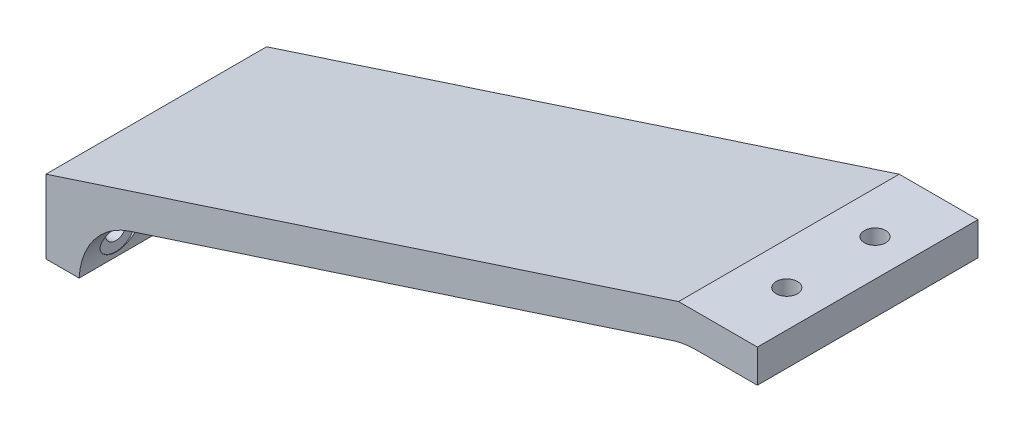
ISO-10303-21;
HEADER;
FILE_DESCRIPTION(('STEP AP214'),'2;1');
FILE_NAME('part.step','',(''),(''),'','','');
FILE_SCHEMA(('AUTOMOTIVE_DESIGN { 1 0 10303 214 1 1 1 1 }'));
ENDSEC;
DATA;
#1=APPLICATION_CONTEXT('core data for automotive mechanical design processes');
#2=APPLICATION_PROTOCOL_DEFINITION('international standard','automotive_design',2000,#1);
#3=PRODUCT_CONTEXT('',#1,'mechanical');
#4=PRODUCT('Part','Part','',(#3));
#5=PRODUCT_RELATED_PRODUCT_CATEGORY('part','',(#4));
#6=PRODUCT_DEFINITION_FORMATION('','',#4);
#7=PRODUCT_DEFINITION_CONTEXT('part definition',#1,'design');
#8=PRODUCT_DEFINITION('design','',#6,#7);
#9=PRODUCT_DEFINITION_SHAPE('','',#8);
#10=(LENGTH_UNIT() NAMED_UNIT(*) SI_UNIT(.MILLI.,.METRE.));
#11=(NAMED_UNIT(*) PLANE_ANGLE_UNIT() SI_UNIT($,.RADIAN.));
#12=(NAMED_UNIT(*) SI_UNIT($,.STERADIAN.) SOLID_ANGLE_UNIT());
#13=UNCERTAINTY_MEASURE_WITH_UNIT(LENGTH_MEASURE(1.E-05),#10,'distance_accuracy_value','');
#14=(GEOMETRIC_REPRESENTATION_CONTEXT(3) GLOBAL_UNCERTAINTY_ASSIGNED_CONTEXT((#13)) GLOBAL_UNIT_ASSIGNED_CONTEXT((#10,
#11,#12)) REPRESENTATION_CONTEXT('',''));
#15=CARTESIAN_POINT('',(0.,0.,0.));
#16=DIRECTION('',(0.,0.,1.));
#17=DIRECTION('',(1.,0.,0.));
#18=AXIS2_PLACEMENT_3D('',#15,#16,#17);
#19=CARTESIAN_POINT('',(86.0160162238115,28.,15.));
#20=DIRECTION('',(0.309533925900526,-0.950888399717132,0.));
#21=DIRECTION('',(0.950888399717132,0.309533925900526,0.));
#22=AXIS2_PLACEMENT_3D('',#19,#20,#21);
#23=PLANE('',#22);
#24=DIRECTION('',(-0.950888399717132,-0.309533925900526,0.));
#25=VECTOR('',#24,1.);
#26=CARTESIAN_POINT('',(86.0160162238115,28.,-15.));
#27=LINE('',#26,#25);
#28=CARTESIAN_POINT('',(86.0160162238115,28.,-15.));
#29=VERTEX_POINT('',#28);
#30=CARTESIAN_POINT('',(0.,0.,-15.));
#31=VERTEX_POINT('',#30);
#32=EDGE_CURVE('E136',#29,#31,#27,.T.);
#33=ORIENTED_EDGE('',*,*,#32,.T.);
#34=DIRECTION('',(0.,0.,-1.));
#35=VECTOR('',#34,1.);
#36=CARTESIAN_POINT('',(0.,0.,15.));
#37=LINE('',#36,#35);
#38=CARTESIAN_POINT('',(0.,0.,15.));
#39=VERTEX_POINT('',#38);
#40=EDGE_CURVE('E118',#39,#31,#37,.T.);
#41=ORIENTED_EDGE('',*,*,#40,.F.);
#42=DIRECTION('',(-0.950888399717132,-0.309533925900526,0.));
#43=VECTOR('',#42,1.);
#44=CARTESIAN_POINT('',(86.0160162238115,28.,15.));
#45=LINE('',#44,#43);
#46=CARTESIAN_POINT('',(86.0160162238115,28.,15.));
#47=VERTEX_POINT('',#46);
#48=EDGE_CURVE('E124',#47,#39,#45,.T.);
#49=ORIENTED_EDGE('',*,*,#48,.F.);
#50=DIRECTION('',(0.,0.,-1.));
#51=VECTOR('',#50,1.);
#52=CARTESIAN_POINT('',(86.0160162238115,28.,15.));
#53=LINE('',#52,#51);
#54=EDGE_CURVE('E245',#47,#29,#53,.T.);
#55=ORIENTED_EDGE('',*,*,#54,.T.);
#56=EDGE_LOOP('',(#33,#41,#49,#55));
#57=FACE_BOUND('',#56,.T.);
#58=ADVANCED_FACE('F41',(#57),#23,.F.);
#59=CARTESIAN_POINT('',(0.,0.,15.));
#60=DIRECTION('',(1.,0.,0.));
#61=DIRECTION('',(0.,1.,0.));
#62=AXIS2_PLACEMENT_3D('',#59,#60,#61);
#63=PLANE('',#62);
#64=CARTESIAN_POINT('',(0.,-6.63378653813209,10.));
#65=DIRECTION('',(1.,0.,0.));
#66=DIRECTION('',(0.,0.,-1.));
#67=AXIS2_PLACEMENT_3D('',#64,#65,#66);
#68=CIRCLE('',#67,1.44999999999999);
#69=CARTESIAN_POINT('',(0.,-6.63378653813209,8.55000000000001));
#70=VERTEX_POINT('',#69);
#71=EDGE_CURVE('E289',#70,#70,#68,.T.);
#72=ORIENTED_EDGE('',*,*,#71,.T.);
#73=EDGE_LOOP('',(#72));
#74=FACE_BOUND('',#73,.T.);
#75=CARTESIAN_POINT('',(0.,-6.63378653813209,-10.));
#76=DIRECTION('',(1.,0.,0.));
#77=DIRECTION('',(0.,0.,-1.));
#78=AXIS2_PLACEMENT_3D('',#75,#76,#77);
#79=CIRCLE('',#78,1.44999999999999);
#80=CARTESIAN_POINT('',(0.,-6.63378653813209,-11.45));
#81=VERTEX_POINT('',#80);
#82=EDGE_CURVE('E286',#81,#81,#79,.T.);
#83=ORIENTED_EDGE('',*,*,#82,.T.);
#84=EDGE_LOOP('',(#83));
#85=FACE_BOUND('',#84,.T.);
#86=DIRECTION('',(0.,-1.,0.));
#87=VECTOR('',#86,1.);
#88=CARTESIAN_POINT('',(0.,0.,-15.));
#89=LINE('',#88,#87);
#90=CARTESIAN_POINT('',(0.,-10.,-15.));
#91=VERTEX_POINT('',#90);
#92=EDGE_CURVE('E247',#31,#91,#89,.T.);
#93=ORIENTED_EDGE('',*,*,#92,.T.);
#94=DIRECTION('',(0.,0.,-1.));
#95=VECTOR('',#94,1.);
#96=CARTESIAN_POINT('',(0.,-10.,15.));
#97=LINE('',#96,#95);
#98=CARTESIAN_POINT('',(0.,-10.,15.));
#99=VERTEX_POINT('',#98);
#100=EDGE_CURVE('E121',#99,#91,#97,.T.);
#101=ORIENTED_EDGE('',*,*,#100,.F.);
#102=DIRECTION('',(0.,-1.,0.));
#103=VECTOR('',#102,1.);
#104=CARTESIAN_POINT('',(0.,0.,15.));
#105=LINE('',#104,#103);
#106=EDGE_CURVE('E114',#39,#99,#105,.T.);
#107=ORIENTED_EDGE('',*,*,#106,.F.);
#108=ORIENTED_EDGE('',*,*,#40,.T.);
#109=EDGE_LOOP('',(#93,#101,#107,#108));
#110=FACE_BOUND('',#109,.T.);
#111=ADVANCED_FACE('F116',(#74,#85,#110),#63,.F.);
#112=CARTESIAN_POINT('',(0.,-10.,15.));
#113=DIRECTION('',(0.,1.,0.));
#114=DIRECTION('',(0.,0.,1.));
#115=AXIS2_PLACEMENT_3D('',#112,#113,#114);
#116=PLANE('',#115);
#117=DIRECTION('',(1.,0.,0.));
#118=VECTOR('',#117,1.);
#119=CARTESIAN_POINT('',(0.,-10.,-15.));
#120=LINE('',#119,#118);
#121=CARTESIAN_POINT('',(4.5,-10.,-15.));
#122=VERTEX_POINT('',#121);
#123=EDGE_CURVE('E250',#91,#122,#120,.T.);
#124=ORIENTED_EDGE('',*,*,#123,.T.);
#125=DIRECTION('',(0.,0.,-1.));
#126=VECTOR('',#125,1.);
#127=CARTESIAN_POINT('',(4.5,-10.,15.));
#128=LINE('',#127,#126);
#129=CARTESIAN_POINT('',(4.5,-10.,15.));
#130=VERTEX_POINT('',#129);
#131=EDGE_CURVE('E142',#130,#122,#128,.T.);
#132=ORIENTED_EDGE('',*,*,#131,.F.);
#133=DIRECTION('',(1.,0.,0.));
#134=VECTOR('',#133,1.);
#135=CARTESIAN_POINT('',(0.,-10.,15.));
#136=LINE('',#135,#134);
#137=EDGE_CURVE('E123',#99,#130,#136,.T.);
#138=ORIENTED_EDGE('',*,*,#137,.F.);
#139=ORIENTED_EDGE('',*,*,#100,.T.);
#140=EDGE_LOOP('',(#124,#132,#138,#139));
#141=FACE_BOUND('',#140,.T.);
#142=ADVANCED_FACE('F213',(#141),#116,.F.);
#143=CARTESIAN_POINT('',(4.5,-3.26757307626418,15.));
#144=DIRECTION('',(-0.309533925900526,0.950888399717132,0.));
#145=DIRECTION('',(-0.950888399717132,-0.309533925900526,0.));
#146=AXIS2_PLACEMENT_3D('',#143,#144,#145);
#147=PLANE('',#146);
#148=DIRECTION('',(0.950888399717132,0.309533925900526,0.));
#149=VECTOR('',#148,1.);
#150=CARTESIAN_POINT('',(4.5,-3.26757307626418,-15.));
#151=LINE('',#150,#149);
#152=CARTESIAN_POINT('',(11.3904204446033,-1.0245980941761,-15.));
#153=VERTEX_POINT('',#152);
#154=CARTESIAN_POINT('',(85.221291354747,23.0088839971713,-15.));
#155=VERTEX_POINT('',#154);
#156=EDGE_CURVE('E253',#153,#155,#151,.T.);
#157=ORIENTED_EDGE('',*,*,#156,.T.);
#158=DIRECTION('',(0.,0.,-1.));
#159=VECTOR('',#158,1.);
#160=CARTESIAN_POINT('',(85.221291354747,23.0088839971713,15.));
#161=LINE('',#160,#159);
#162=CARTESIAN_POINT('',(85.221291354747,23.0088839971713,15.));
#163=VERTEX_POINT('',#162);
#164=EDGE_CURVE('E59',#155,#163,#161,.F.);
#165=ORIENTED_EDGE('',*,*,#164,.T.);
#166=DIRECTION('',(0.950888399717132,0.309533925900526,0.));
#167=VECTOR('',#166,1.);
#168=CARTESIAN_POINT('',(4.5,-3.26757307626418,15.));
#169=LINE('',#168,#167);
#170=CARTESIAN_POINT('',(11.3904204446033,-1.0245980941761,15.));
#171=VERTEX_POINT('',#170);
#172=EDGE_CURVE('E232',#171,#163,#169,.T.);
#173=ORIENTED_EDGE('',*,*,#172,.F.);
#174=DIRECTION('',(0.,0.,-1.));
#175=VECTOR('',#174,1.);
#176=CARTESIAN_POINT('',(11.3904204446033,-1.0245980941761,15.));
#177=LINE('',#176,#175);
#178=EDGE_CURVE('E140',#171,#153,#177,.T.);
#179=ORIENTED_EDGE('',*,*,#178,.T.);
#180=EDGE_LOOP('',(#157,#165,#173,#179));
#181=FACE_BOUND('',#180,.T.);
#182=ADVANCED_FACE('F209',(#181),#147,.F.);
#183=CARTESIAN_POINT('',(86.73,23.5,15.));
#184=DIRECTION('',(0.,1.,0.));
#185=DIRECTION('',(0.,0.,1.));
#186=AXIS2_PLACEMENT_3D('',#183,#184,#185);
#187=PLANE('',#186);
#188=CARTESIAN_POINT('',(91.73,23.5,6.));
#189=DIRECTION('',(0.,-1.,0.));
#190=DIRECTION('',(0.,0.,-1.));
#191=AXIS2_PLACEMENT_3D('',#188,#189,#190);
#192=CIRCLE('',#191,1.44999999999999);
#193=CARTESIAN_POINT('',(91.73,23.5,4.55000000000001));
#194=VERTEX_POINT('',#193);
#195=EDGE_CURVE('E283',#194,#194,#192,.T.);
#196=ORIENTED_EDGE('',*,*,#195,.F.);
#197=EDGE_LOOP('',(#196));
#198=FACE_BOUND('',#197,.T.);
#199=CARTESIAN_POINT('',(91.73,23.5,-6.));
#200=DIRECTION('',(0.,-1.,0.));
#201=DIRECTION('',(0.,0.,-1.));
#202=AXIS2_PLACEMENT_3D('',#199,#200,#201);
#203=CIRCLE('',#202,1.44999999999999);
#204=CARTESIAN_POINT('',(91.73,23.5,-7.44999999999999));
#205=VERTEX_POINT('',#204);
#206=EDGE_CURVE('E277',#205,#205,#203,.T.);
#207=ORIENTED_EDGE('',*,*,#206,.F.);
#208=EDGE_LOOP('',(#207));
#209=FACE_BOUND('',#208,.T.);
#210=DIRECTION('',(1.,0.,0.));
#211=VECTOR('',#210,1.);
#212=CARTESIAN_POINT('',(86.73,23.5,15.));
#213=LINE('',#212,#211);
#214=CARTESIAN_POINT('',(88.3166306137522,23.5,15.));
#215=VERTEX_POINT('',#214);
#216=CARTESIAN_POINT('',(96.73,23.5,15.));
#217=VERTEX_POINT('',#216);
#218=EDGE_CURVE('E230',#215,#217,#213,.T.);
#219=ORIENTED_EDGE('',*,*,#218,.F.);
#220=DIRECTION('',(0.,0.,-1.));
#221=VECTOR('',#220,1.);
#222=CARTESIAN_POINT('',(88.3166306137522,23.5,-15.));
#223=LINE('',#222,#221);
#224=CARTESIAN_POINT('',(88.3166306137522,23.5,-15.));
#225=VERTEX_POINT('',#224);
#226=EDGE_CURVE('E137',#215,#225,#223,.T.);
#227=ORIENTED_EDGE('',*,*,#226,.T.);
#228=DIRECTION('',(1.,0.,0.));
#229=VECTOR('',#228,1.);
#230=CARTESIAN_POINT('',(86.73,23.5,-15.));
#231=LINE('',#230,#229);
#232=CARTESIAN_POINT('',(96.73,23.5,-15.));
#233=VERTEX_POINT('',#232);
#234=EDGE_CURVE('E255',#225,#233,#231,.T.);
#235=ORIENTED_EDGE('',*,*,#234,.T.);
#236=DIRECTION('',(0.,0.,-1.));
#237=VECTOR('',#236,1.);
#238=CARTESIAN_POINT('',(96.73,23.5,15.));
#239=LINE('',#238,#237);
#240=EDGE_CURVE('E236',#217,#233,#239,.T.);
#241=ORIENTED_EDGE('',*,*,#240,.F.);
#242=EDGE_LOOP('',(#219,#227,#235,#241));
#243=FACE_BOUND('',#242,.T.);
#244=ADVANCED_FACE('F205',(#198,#209,#243),#187,.F.);
#245=CARTESIAN_POINT('',(96.73,23.5,15.));
#246=DIRECTION('',(-1.,0.,0.));
#247=DIRECTION('',(0.,-1.,0.));
#248=AXIS2_PLACEMENT_3D('',#245,#246,#247);
#249=PLANE('',#248);
#250=DIRECTION('',(0.,1.,0.));
#251=VECTOR('',#250,1.);
#252=CARTESIAN_POINT('',(96.73,23.5,-15.));
#253=LINE('',#252,#251);
#254=CARTESIAN_POINT('',(96.73,28.,-15.));
#255=VERTEX_POINT('',#254);
#256=EDGE_CURVE('E257',#233,#255,#253,.T.);
#257=ORIENTED_EDGE('',*,*,#256,.T.);
#258=DIRECTION('',(0.,0.,-1.));
#259=VECTOR('',#258,1.);
#260=CARTESIAN_POINT('',(96.73,28.,15.));
#261=LINE('',#260,#259);
#262=CARTESIAN_POINT('',(96.73,28.,15.));
#263=VERTEX_POINT('',#262);
#264=EDGE_CURVE('E261',#263,#255,#261,.T.);
#265=ORIENTED_EDGE('',*,*,#264,.F.);
#266=DIRECTION('',(0.,1.,0.));
#267=VECTOR('',#266,1.);
#268=CARTESIAN_POINT('',(96.73,23.5,15.));
#269=LINE('',#268,#267);
#270=EDGE_CURVE('E238',#217,#263,#269,.T.);
#271=ORIENTED_EDGE('',*,*,#270,.F.);
#272=ORIENTED_EDGE('',*,*,#240,.T.);
#273=EDGE_LOOP('',(#257,#265,#271,#272));
#274=FACE_BOUND('',#273,.T.);
#275=ADVANCED_FACE('F201',(#274),#249,.F.);
#276=CARTESIAN_POINT('',(96.73,28.,15.));
#277=DIRECTION('',(0.,-1.,0.));
#278=DIRECTION('',(0.,0.,-1.));
#279=AXIS2_PLACEMENT_3D('',#276,#277,#278);
#280=PLANE('',#279);
#281=CARTESIAN_POINT('',(91.73,28.,6.));
#282=DIRECTION('',(0.,-1.,0.));
#283=DIRECTION('',(0.,0.,-1.));
#284=AXIS2_PLACEMENT_3D('',#281,#282,#283);
#285=CIRCLE('',#284,1.44999999999999);
#286=CARTESIAN_POINT('',(91.73,28.,4.55000000000001));
#287=VERTEX_POINT('',#286);
#288=EDGE_CURVE('E280',#287,#287,#285,.T.);
#289=ORIENTED_EDGE('',*,*,#288,.T.);
#290=EDGE_LOOP('',(#289));
#291=FACE_BOUND('',#290,.T.);
#292=CARTESIAN_POINT('',(91.73,28.,-6.));
#293=DIRECTION('',(0.,-1.,0.));
#294=DIRECTION('',(0.,0.,-1.));
#295=AXIS2_PLACEMENT_3D('',#292,#293,#294);
#296=CIRCLE('',#295,1.44999999999999);
#297=CARTESIAN_POINT('',(91.73,28.,-7.44999999999999));
#298=VERTEX_POINT('',#297);
#299=EDGE_CURVE('E248',#298,#298,#296,.T.);
#300=ORIENTED_EDGE('',*,*,#299,.T.);
#301=EDGE_LOOP('',(#300));
#302=FACE_BOUND('',#301,.T.);
#303=DIRECTION('',(-1.,0.,0.));
#304=VECTOR('',#303,1.);
#305=CARTESIAN_POINT('',(96.73,28.,-15.));
#306=LINE('',#305,#304);
#307=EDGE_CURVE('E133',#255,#29,#306,.T.);
#308=ORIENTED_EDGE('',*,*,#307,.T.);
#309=ORIENTED_EDGE('',*,*,#54,.F.);
#310=DIRECTION('',(-1.,0.,0.));
#311=VECTOR('',#310,1.);
#312=CARTESIAN_POINT('',(96.73,28.,15.));
#313=LINE('',#312,#311);
#314=EDGE_CURVE('E129',#263,#47,#313,.T.);
#315=ORIENTED_EDGE('',*,*,#314,.F.);
#316=ORIENTED_EDGE('',*,*,#264,.T.);
#317=EDGE_LOOP('',(#308,#309,#315,#316));
#318=FACE_BOUND('',#317,.T.);
#319=ADVANCED_FACE('F195',(#291,#302,#318),#280,.F.);
#320=CARTESIAN_POINT('',(0.,0.,15.));
#321=DIRECTION('',(0.,0.,1.));
#322=DIRECTION('',(1.,0.,0.));
#323=AXIS2_PLACEMENT_3D('',#320,#321,#322);
#324=PLANE('',#323);
#325=ORIENTED_EDGE('',*,*,#48,.T.);
#326=ORIENTED_EDGE('',*,*,#106,.T.);
#327=ORIENTED_EDGE('',*,*,#137,.T.);
#328=CARTESIAN_POINT('',(14.4857597036085,-10.5334820913474,15.));
#329=DIRECTION('',(0.,0.,1.));
#330=DIRECTION('',(1.,0.,0.));
#331=AXIS2_PLACEMENT_3D('',#328,#329,#330);
#332=CIRCLE('',#331,10.);
#333=EDGE_CURVE('E11',#130,#171,#332,.F.);
#334=ORIENTED_EDGE('',*,*,#333,.T.);
#335=ORIENTED_EDGE('',*,*,#172,.T.);
#336=CARTESIAN_POINT('',(88.3166306137522,13.5,15.));
#337=DIRECTION('',(0.,0.,1.));
#338=DIRECTION('',(1.,0.,0.));
#339=AXIS2_PLACEMENT_3D('',#336,#337,#338);
#340=CIRCLE('',#339,10.);
#341=EDGE_CURVE('E151',#163,#215,#340,.F.);
#342=ORIENTED_EDGE('',*,*,#341,.T.);
#343=ORIENTED_EDGE('',*,*,#218,.T.);
#344=ORIENTED_EDGE('',*,*,#270,.T.);
#345=ORIENTED_EDGE('',*,*,#314,.T.);
#346=EDGE_LOOP('',(#325,#326,#327,#334,#335,#342,#343,#344,#345));
#347=FACE_BOUND('',#346,.T.);
#348=ADVANCED_FACE('F127',(#347),#324,.T.);
#349=CARTESIAN_POINT('',(0.,0.,-15.));
#350=DIRECTION('',(0.,0.,1.));
#351=DIRECTION('',(1.,0.,0.));
#352=AXIS2_PLACEMENT_3D('',#349,#350,#351);
#353=PLANE('',#352);
#354=ORIENTED_EDGE('',*,*,#32,.F.);
#355=ORIENTED_EDGE('',*,*,#307,.F.);
#356=ORIENTED_EDGE('',*,*,#256,.F.);
#357=ORIENTED_EDGE('',*,*,#234,.F.);
#358=CARTESIAN_POINT('',(88.3166306137522,13.5,-15.));
#359=DIRECTION('',(0.,0.,1.));
#360=DIRECTION('',(1.,0.,0.));
#361=AXIS2_PLACEMENT_3D('',#358,#359,#360);
#362=CIRCLE('',#361,10.);
#363=EDGE_CURVE('E149',#225,#155,#362,.T.);
#364=ORIENTED_EDGE('',*,*,#363,.T.);
#365=ORIENTED_EDGE('',*,*,#156,.F.);
#366=CARTESIAN_POINT('',(14.4857597036085,-10.5334820913474,-15.));
#367=DIRECTION('',(0.,0.,1.));
#368=DIRECTION('',(1.,0.,0.));
#369=AXIS2_PLACEMENT_3D('',#366,#367,#368);
#370=CIRCLE('',#369,10.);
#371=EDGE_CURVE('E51',#153,#122,#370,.T.);
#372=ORIENTED_EDGE('',*,*,#371,.T.);
#373=ORIENTED_EDGE('',*,*,#123,.F.);
#374=ORIENTED_EDGE('',*,*,#92,.F.);
#375=EDGE_LOOP('',(#354,#355,#356,#357,#364,#365,#372,#373,#374));
#376=FACE_BOUND('',#375,.T.);
#377=ADVANCED_FACE('F191',(#376),#353,.F.);
#378=CARTESIAN_POINT('',(91.73,23.5,-6.));
#379=DIRECTION('',(0.,-1.,0.));
#380=DIRECTION('',(0.,0.,-1.));
#381=AXIS2_PLACEMENT_3D('',#378,#379,#380);
#382=CYLINDRICAL_SURFACE('',#381,1.44999999999999);
#383=ORIENTED_EDGE('',*,*,#299,.F.);
#384=EDGE_LOOP('',(#383));
#385=FACE_BOUND('',#384,.T.);
#386=ORIENTED_EDGE('',*,*,#206,.T.);
#387=EDGE_LOOP('',(#386));
#388=FACE_BOUND('',#387,.T.);
#389=ADVANCED_FACE('F187',(#385,#388),#382,.F.);
#390=CARTESIAN_POINT('',(91.73,23.5,6.));
#391=DIRECTION('',(0.,-1.,0.));
#392=DIRECTION('',(0.,0.,-1.));
#393=AXIS2_PLACEMENT_3D('',#390,#391,#392);
#394=CYLINDRICAL_SURFACE('',#393,1.44999999999999);
#395=ORIENTED_EDGE('',*,*,#288,.F.);
#396=EDGE_LOOP('',(#395));
#397=FACE_BOUND('',#396,.T.);
#398=ORIENTED_EDGE('',*,*,#195,.T.);
#399=EDGE_LOOP('',(#398));
#400=FACE_BOUND('',#399,.T.);
#401=ADVANCED_FACE('F183',(#397,#400),#394,.F.);
#402=CARTESIAN_POINT('',(4.5,-6.63378653813209,-10.));
#403=DIRECTION('',(1.,0.,0.));
#404=DIRECTION('',(0.,0.,-1.));
#405=AXIS2_PLACEMENT_3D('',#402,#403,#404);
#406=CYLINDRICAL_SURFACE('',#405,1.44999999999999);
#407=CARTESIAN_POINT('',(4.5,-6.63378653813209,-10.));
#408=DIRECTION('',(-1.,0.,0.));
#409=DIRECTION('',(0.,-1.,0.));
#410=AXIS2_PLACEMENT_3D('',#407,#408,#409);
#411=CIRCLE('',#410,1.44999999999999);
#412=CARTESIAN_POINT('',(4.5,-8.08378653813207,-10.));
#413=VERTEX_POINT('',#412);
#414=EDGE_CURVE('E46',#413,#413,#411,.F.);
#415=ORIENTED_EDGE('',*,*,#414,.T.);
#416=EDGE_LOOP('',(#415));
#417=FACE_BOUND('',#416,.T.);
#418=ORIENTED_EDGE('',*,*,#82,.F.);
#419=EDGE_LOOP('',(#418));
#420=FACE_BOUND('',#419,.T.);
#421=ADVANCED_FACE('F179',(#417,#420),#406,.F.);
#422=CARTESIAN_POINT('',(4.5,-6.63378653813209,10.));
#423=DIRECTION('',(1.,0.,0.));
#424=DIRECTION('',(0.,0.,-1.));
#425=AXIS2_PLACEMENT_3D('',#422,#423,#424);
#426=CYLINDRICAL_SURFACE('',#425,1.44999999999999);
#427=CARTESIAN_POINT('',(4.5,-6.63378653813209,10.));
#428=DIRECTION('',(-1.,0.,0.));
#429=DIRECTION('',(0.,-1.,0.));
#430=AXIS2_PLACEMENT_3D('',#427,#428,#429);
#431=CIRCLE('',#430,1.44999999999999);
#432=CARTESIAN_POINT('',(4.5,-8.08378653813208,10.));
#433=VERTEX_POINT('',#432);
#434=EDGE_CURVE('E306',#433,#433,#431,.F.);
#435=ORIENTED_EDGE('',*,*,#434,.T.);
#436=EDGE_LOOP('',(#435));
#437=FACE_BOUND('',#436,.T.);
#438=ORIENTED_EDGE('',*,*,#71,.F.);
#439=EDGE_LOOP('',(#438));
#440=FACE_BOUND('',#439,.T.);
#441=ADVANCED_FACE('F175',(#437,#440),#426,.F.);
#442=CARTESIAN_POINT('',(88.3166306137522,13.5,15.));
#443=DIRECTION('',(0.,0.,1.));
#444=DIRECTION('',(1.,0.,0.));
#445=AXIS2_PLACEMENT_3D('',#442,#443,#444);
#446=CYLINDRICAL_SURFACE('',#445,10.);
#447=ORIENTED_EDGE('',*,*,#341,.F.);
#448=ORIENTED_EDGE('',*,*,#164,.F.);
#449=ORIENTED_EDGE('',*,*,#363,.F.);
#450=ORIENTED_EDGE('',*,*,#226,.F.);
#451=EDGE_LOOP('',(#447,#448,#449,#450));
#452=FACE_BOUND('',#451,.T.);
#453=ADVANCED_FACE('F178',(#452),#446,.F.);
#454=CARTESIAN_POINT('',(14.4857597036085,-10.5334820913474,15.));
#455=DIRECTION('',(0.,0.,-1.));
#456=DIRECTION('',(-1.,0.,0.));
#457=AXIS2_PLACEMENT_3D('',#454,#455,#456);
#458=CYLINDRICAL_SURFACE('',#457,10.);
#459=CARTESIAN_POINT('',(4.55206954662678,-9.38378653813157,-9.99999999999946));
#460=CARTESIAN_POINT('',(4.55206982052395,-9.38378726165786,-9.84673741857194));
#461=CARTESIAN_POINT('',(4.55353082220492,-9.37094352722969,-9.69348206696144));
#462=CARTESIAN_POINT('',(4.55963299731034,-9.31994966077079,-9.39131360266087));
#463=CARTESIAN_POINT('',(4.56427389402336,-9.28180173069613,-9.24240011332151));
#464=CARTESIAN_POINT('',(4.57746897504317,-9.18132635153864,-8.95310323084345));
#465=CARTESIAN_POINT('',(4.58602416781782,-9.11899267193888,-8.81272204650808));
#466=CARTESIAN_POINT('',(4.60813409530222,-8.97207060262114,-8.54456300342989));
#467=CARTESIAN_POINT('',(4.62168863552101,-8.88748307868718,-8.41678465464062));
#468=CARTESIAN_POINT('',(4.6549670429253,-8.69920192529294,-8.17803214341673));
#469=CARTESIAN_POINT('',(4.67466299207084,-8.5955956122894,-8.06698524434445));
#470=CARTESIAN_POINT('',(4.72138224931024,-8.37248930530676,-7.86408220361161));
#471=CARTESIAN_POINT('',(4.74840475078437,-8.25299106169365,-7.77222395133909));
#472=CARTESIAN_POINT('',(4.81044375627722,-8.00271454648484,-7.61030223950831));
#473=CARTESIAN_POINT('',(4.84542460756726,-7.8719881545294,-7.54014477351481));
#474=CARTESIAN_POINT('',(4.92371682510235,-7.60313553190046,-7.42232405458484));
#475=CARTESIAN_POINT('',(4.96702871520723,-7.46500883628649,-7.37466221683576));
#476=CARTESIAN_POINT('',(5.06281369464114,-7.18222913279489,-7.30119116643842));
#477=CARTESIAN_POINT('',(5.1154828959829,-7.03749907577993,-7.27593793476282));
#478=CARTESIAN_POINT('',(5.22831611591865,-6.74880353710942,-7.24857855354742));
#479=CARTESIAN_POINT('',(5.28848258484908,-6.60483832154056,-7.24647999183461));
#480=CARTESIAN_POINT('',(5.41983875007594,-6.31008698618938,-7.2648261344744));
#481=CARTESIAN_POINT('',(5.49152078952699,-6.15963170361501,-7.28702279725287));
#482=CARTESIAN_POINT('',(5.63993590791953,-5.86674828649485,-7.35485815374874));
#483=CARTESIAN_POINT('',(5.71667068336935,-5.72432287816406,-7.40050475637757));
#484=CARTESIAN_POINT('',(5.8815808090935,-5.43457029962958,-7.51975631931397));
#485=CARTESIAN_POINT('',(5.97007558765998,-5.28847768405689,-7.59591803140772));
#486=CARTESIAN_POINT('',(6.14687490678675,-5.01170857678292,-7.77324882816025));
#487=CARTESIAN_POINT('',(6.23517895071667,-4.88105595895432,-7.87445591024788));
#488=CARTESIAN_POINT('',(6.36668700586784,-4.69507741877183,-8.04764187855635));
#489=CARTESIAN_POINT('',(6.41169621943829,-4.63306579454466,-8.11120102478316));
#490=CARTESIAN_POINT('',(6.49945974107283,-4.51480756861264,-8.24488977187408));
#491=CARTESIAN_POINT('',(6.54221355180075,-4.45856223586763,-8.31502081251155));
#492=CARTESIAN_POINT('',(6.66545785193194,-4.29964795658098,-8.53479595651685));
#493=CARTESIAN_POINT('',(6.74130939828009,-4.20627751158841,-8.69430201258136));
#494=CARTESIAN_POINT('',(6.84742365040189,-4.07901703722884,-8.97517544089949));
#495=CARTESIAN_POINT('',(6.88430149412547,-4.03578651470585,-9.08989278252978));
#496=CARTESIAN_POINT('',(6.94579906025304,-3.96452411304915,-9.32708907552071));
#497=CARTESIAN_POINT('',(6.97043435336173,-3.93647292399962,-9.44955794331556));
#498=CARTESIAN_POINT('',(7.00505470791079,-3.89723488161391,-9.70008407488732));
#499=CARTESIAN_POINT('',(7.01494484263072,-3.88615728874114,-9.82817213001944));
#500=CARTESIAN_POINT('',(7.0185531623273,-3.88210332616821,-10.0848654840275));
#501=CARTESIAN_POINT('',(7.01227395546368,-3.88912403716155,-10.2134706961436));
#502=CARTESIAN_POINT('',(6.98564479502107,-3.9192092029208,-10.4549848044428));
#503=CARTESIAN_POINT('',(6.96664816655602,-3.94073175535546,-10.5682462634037));
#504=CARTESIAN_POINT('',(6.9177416525224,-3.99693234010578,-10.7889826340901));
#505=CARTESIAN_POINT('',(6.88782485589377,-4.03161870397186,-10.8964538317869));
#506=CARTESIAN_POINT('',(6.80750688326084,-4.12649567337443,-11.1394445417293));
#507=CARTESIAN_POINT('',(6.75359923546181,-4.19135190264917,-11.2719804482957));
#508=CARTESIAN_POINT('',(6.6351668497614,-4.33855525317389,-11.5216769801698));
#509=CARTESIAN_POINT('',(6.5706264797696,-4.4209281798844,-11.6388145041505));
#510=CARTESIAN_POINT('',(6.4341074973582,-4.60187700224849,-11.8586060058554));
#511=CARTESIAN_POINT('',(6.36202676976357,-4.70069011302122,-11.960999528345));
#512=CARTESIAN_POINT('',(6.21477510393997,-4.91143941175419,-12.1484691049352));
#513=CARTESIAN_POINT('',(6.13960421096291,-5.02337540758931,-12.2335454125182));
#514=CARTESIAN_POINT('',(5.97311474583696,-5.28339921056249,-12.4015951568873));
#515=CARTESIAN_POINT('',(5.88170883154889,-5.43415049199739,-12.4804030602133));
#516=CARTESIAN_POINT('',(5.70244566524046,-5.74951760619979,-12.6095222876562));
#517=CARTESIAN_POINT('',(5.61459057683378,-5.9141417090762,-12.6598164736523));
#518=CARTESIAN_POINT('',(5.44463947485841,-6.25619965581656,-12.729625932791));
#519=CARTESIAN_POINT('',(5.36265837365969,-6.43379655462533,-12.748634824264));
#520=CARTESIAN_POINT('',(5.20929991484931,-6.79377027615808,-12.7512196871753));
#521=CARTESIAN_POINT('',(5.13791253252736,-6.97614238535757,-12.7348293879118));
#522=CARTESIAN_POINT('',(5.01489079035425,-7.31909225788899,-12.6683446546134));
#523=CARTESIAN_POINT('',(4.96196524626899,-7.47993300964539,-12.6220027817831));
#524=CARTESIAN_POINT('',(4.86715328334527,-7.79319921758867,-12.4992990619171));
#525=CARTESIAN_POINT('',(4.82525981605253,-7.94562999749477,-12.4229564606081));
#526=CARTESIAN_POINT('',(4.75584265339589,-8.22113725187954,-12.2509017462458));
#527=CARTESIAN_POINT('',(4.72730855195926,-8.34562603582999,-12.1578463680091));
#528=CARTESIAN_POINT('',(4.67811242252807,-8.57793469624847,-11.9511382108022));
#529=CARTESIAN_POINT('',(4.65744867130058,-8.68575821854175,-11.8374899487469));
#530=CARTESIAN_POINT('',(4.6233431301336,-8.87759997905706,-11.5970780365191));
#531=CARTESIAN_POINT('',(4.60968039930829,-8.96230091739375,-11.4708891151836));
#532=CARTESIAN_POINT('',(4.58732331834083,-9.10991298071391,-11.2059423276487));
#533=CARTESIAN_POINT('',(4.57862940616916,-9.17282218469898,-11.0671833547259));
#534=CARTESIAN_POINT('',(4.56491583074655,-9.27661551140503,-10.7762656618916));
#535=CARTESIAN_POINT('',(4.56002744880452,-9.31670082625479,-10.6238152988671));
#536=CARTESIAN_POINT('',(4.55360410171062,-9.37028648121989,-10.3142408778587));
#537=CARTESIAN_POINT('',(4.55206926584199,-9.38378579641094,-10.1571166399281));
#538=CARTESIAN_POINT('',(4.55206954662678,-9.38378653813157,-9.99999999999946));
#539=B_SPLINE_CURVE_WITH_KNOTS('',3,(#459,#460,#461,#462,#463,#464,#465,#466,#467,#468,#469,
#470,#471,#472,#473,#474,#475,#476,#477,#478,#479,#480,#481,#482,#483,#484,#485,#486,#487,#488,
#489,#490,#491,#492,#493,#494,#495,#496,#497,#498,#499,#500,#501,#502,#503,#504,#505,#506,#507,
#508,#509,#510,#511,#512,#513,#514,#515,#516,#517,#518,#519,#520,#521,#522,#523,#524,#525,#526,
#527,#528,#529,#530,#531,#532,#533,#534,#535,#536,#537,#538),.UNSPECIFIED.,.T.,.F.,(4,2,2,2,2,2,
2,2,2,2,2,2,2,2,2,2,2,2,2,2,2,2,2,2,2,2,2,2,2,2,2,2,2,2,2,2,2,2,2,4),(0.,0.459234315257659,
0.918428673459777,1.37774140383782,1.837036267333,2.29427294882244,2.75145931108135,
3.20663649922516,3.66184231849621,4.12804969937625,4.59440985271764,5.09675488332898,
5.59926945012028,6.1580091808705,6.71760185368379,7.01588912089023,7.31424189045748,
7.90856847873692,8.29121837302551,8.67338033995333,9.05799213152919,9.44254188804098,
9.79156990781211,10.1408192014394,10.6095568197214,11.0789898226182,11.5559010723801,
12.0328053408116,12.6095068074236,13.1865545329769,13.7728536172553,14.3585943065175,
14.882313261956,15.405696794175,15.8774032544853,16.3490063740266,16.8046332149634,
17.2603002103831,17.7310646359778,18.2018472097879),.UNSPECIFIED.);
#540=CARTESIAN_POINT('',(4.55206954662678,-9.38378653813157,-9.99999999999946));
#541=VERTEX_POINT('',#540);
#542=EDGE_CURVE('E161',#541,#541,#539,.T.);
#543=ORIENTED_EDGE('',*,*,#542,.T.);
#544=EDGE_LOOP('',(#543));
#545=FACE_BOUND('',#544,.T.);
#546=CARTESIAN_POINT('',(4.55206954671151,-9.38378653739949,9.99999999999946));
#547=CARTESIAN_POINT('',(4.55206982060867,-9.38378726092577,10.153262581385));
#548=CARTESIAN_POINT('',(4.55353082229021,-9.37094352650122,10.3065179329535));
#549=CARTESIAN_POINT('',(4.55963299739766,-9.31994966005667,10.6086863971715));
#550=CARTESIAN_POINT('',(4.56427389411217,-9.28180172999272,10.7575998864702));
#551=CARTESIAN_POINT('',(4.57746897513537,-9.18132635086352,11.0468967688691));
#552=CARTESIAN_POINT('',(4.58602416791192,-9.11899267128135,11.1872779531661));
#553=CARTESIAN_POINT('',(4.60813409539974,-8.97207060200521,11.4554369961709));
#554=CARTESIAN_POINT('',(4.62168863562004,-8.88748307809526,11.5832153449252));
#555=CARTESIAN_POINT('',(4.65496704302606,-8.69920192475429,11.8219678560844));
#556=CARTESIAN_POINT('',(4.67466299217184,-8.5955956117799,11.9330147551268));
#557=CARTESIAN_POINT('',(4.72138224940945,-8.37248930486014,12.1359177958054));
#558=CARTESIAN_POINT('',(4.74840475088154,-8.25299106128074,12.2277760480535));
#559=CARTESIAN_POINT('',(4.81044375636771,-8.0027145461406,12.3896977598429));
#560=CARTESIAN_POINT('',(4.84542460765322,-7.87198815421991,12.4598552258192));
#561=CARTESIAN_POINT('',(4.92371682517592,-7.6031355316621,12.5776759447205));
#562=CARTESIAN_POINT('',(4.96702871527292,-7.46500883608452,12.6253377824582));
#563=CARTESIAN_POINT('',(5.06281369468812,-7.18222913266442,12.6988088328391));
#564=CARTESIAN_POINT('',(5.1154828960191,-7.03749907568453,12.7240620645093));
#565=CARTESIAN_POINT('',(5.22831611592994,-6.74880353708331,12.7514214457191));
#566=CARTESIAN_POINT('',(5.28848258484624,-6.60483832154867,12.7535200074315));
#567=CARTESIAN_POINT('',(5.41983875004063,-6.31008698626673,12.7351738647956));
#568=CARTESIAN_POINT('',(5.49152078947311,-6.15963170372727,12.7129772020217));
#569=CARTESIAN_POINT('',(5.63993590782551,-5.86674828667444,12.6451418455392));
#570=CARTESIAN_POINT('',(5.71667068325376,-5.72432287837608,12.5994952429192));
#571=CARTESIAN_POINT('',(5.88158080892764,-5.43457029991108,12.4802436800067));
#572=CARTESIAN_POINT('',(5.97007558746503,-5.28847768437484,12.404081967929));
#573=CARTESIAN_POINT('',(6.14687490653133,-5.01170857716999,12.2267511712136));
#574=CARTESIAN_POINT('',(6.23517895042988,-4.88105595937407,12.125544089147));
#575=CARTESIAN_POINT('',(6.36668700552986,-4.69507741924221,11.9523581208774));
#576=CARTESIAN_POINT('',(6.41169621908093,-4.633065795034,11.888798974667));
#577=CARTESIAN_POINT('',(6.49945974067692,-4.5148075691383,11.7551102276111));
#578=CARTESIAN_POINT('',(6.54221355138568,-4.45856223641065,11.6849791869922));
#579=CARTESIAN_POINT('',(6.66545785146047,-4.29964795717347,11.4652040430456));
#580=CARTESIAN_POINT('',(6.74130939777228,-4.2062775122106,11.3056979870246));
#581=CARTESIAN_POINT('',(6.84742364984477,-4.07901703788835,11.0248245587762));
#582=CARTESIAN_POINT('',(6.88430149355215,-4.03578651537669,10.9101072171685));
#583=CARTESIAN_POINT('',(6.94579905965052,-3.96452411374085,10.6729109242255));
#584=CARTESIAN_POINT('',(6.97043435274622,-3.93647292470087,10.5504420564559));
#585=CARTESIAN_POINT('',(7.00505470727396,-3.89723488233184,10.2999159249378));
#586=CARTESIAN_POINT('',(7.01494484198565,-3.88615728946612,10.171827869834));
#587=CARTESIAN_POINT('',(7.018553161672,-3.88210332690389,9.91513451588413));
#588=CARTESIAN_POINT('',(7.01227395480637,-3.88912403790088,9.78652930379786));
#589=CARTESIAN_POINT('',(6.98564479436537,-3.9192092036643,9.54501519555051));
#590=CARTESIAN_POINT('',(6.96664816590285,-3.94073175610043,9.43175373661177));
#591=CARTESIAN_POINT('',(6.91774165187783,-3.99693234085208,9.21101736596934));
#592=CARTESIAN_POINT('',(6.88782485525527,-4.03161870471804,9.10354616829437));
#593=CARTESIAN_POINT('',(6.80750688264183,-4.12649567411637,8.86055545840832));
#594=CARTESIAN_POINT('',(6.75359923485803,-4.19135190338553,8.72801955187558));
#595=CARTESIAN_POINT('',(6.63516684919206,-4.33855525389565,8.47832302006657));
#596=CARTESIAN_POINT('',(6.57062647921948,-4.42092818059712,8.36118549611713));
#597=CARTESIAN_POINT('',(6.43410749684978,-4.60187700293905,8.14139399447418));
#598=CARTESIAN_POINT('',(6.36202676927773,-4.70069011369845,8.03900047201522));
#599=CARTESIAN_POINT('',(6.21477510350041,-4.91143941240144,7.85153089548387));
#600=CARTESIAN_POINT('',(6.13960421054706,-5.02337540821991,7.76645458792931));
#601=CARTESIAN_POINT('',(5.97311474547924,-5.28339921114394,7.5984048436263));
#602=CARTESIAN_POINT('',(5.88170883122567,-5.4341504925445,7.51959694033593));
#603=CARTESIAN_POINT('',(5.70244566498473,-5.74951760667119,7.39047771295758));
#604=CARTESIAN_POINT('',(5.61459057661103,-5.9141417095062,7.34018352699035));
#605=CARTESIAN_POINT('',(5.44463947469945,-6.2561996561551,7.27037406790195));
#606=CARTESIAN_POINT('',(5.36265837353143,-6.43379655491362,7.25136517644989));
#607=CARTESIAN_POINT('',(5.20929991477712,-6.79377027634026,7.24878031356944));
#608=CARTESIAN_POINT('',(5.13791253248055,-6.97614238548389,7.26517061284285));
#609=CARTESIAN_POINT('',(5.01489079034726,-7.31909225791222,7.33165534614873));
#610=CARTESIAN_POINT('',(4.96196524627746,-7.47993300962161,7.37799721897895));
#611=CARTESIAN_POINT('',(4.86715328337978,-7.79319921747045,7.50070093883555));
#612=CARTESIAN_POINT('',(4.82525981609763,-7.9456299973291,7.57704354013527));
#613=CARTESIAN_POINT('',(4.75584265345609,-8.22113725162854,7.74909825447321));
#614=CARTESIAN_POINT('',(4.72730855202458,-8.34562603554064,7.84215363269605));
#615=CARTESIAN_POINT('',(4.67811242260104,-8.57793469588476,8.04886178986922));
#616=CARTESIAN_POINT('',(4.65744867137607,-8.68575821814203,8.16251005190457));
#617=CARTESIAN_POINT('',(4.62334313021244,-8.87759997858948,8.40292196408707));
#618=CARTESIAN_POINT('',(4.60968039938798,-8.96230091689429,8.52911088539729));
#619=CARTESIAN_POINT('',(4.58732331842144,-9.10991298015496,8.79405767287681));
#620=CARTESIAN_POINT('',(4.57862940624983,-9.17282218411244,8.93281664576958));
#621=CARTESIAN_POINT('',(4.56491583082925,-9.27661551075395,9.22373433850036));
#622=CARTESIAN_POINT('',(4.5600274488881,-9.31670082557345,9.37618470144907));
#623=CARTESIAN_POINT('',(4.55360410179522,-9.37028648049805,9.68575912230108));
#624=CARTESIAN_POINT('',(4.55206926592672,-9.38378579567887,9.84288336015119));
#625=CARTESIAN_POINT('',(4.55206954671151,-9.38378653739949,9.99999999999946));
#626=B_SPLINE_CURVE_WITH_KNOTS('',3,(#546,#547,#548,#549,#550,#551,#552,#553,#554,#555,#556,
#557,#558,#559,#560,#561,#562,#563,#564,#565,#566,#567,#568,#569,#570,#571,#572,#573,#574,#575,
#576,#577,#578,#579,#580,#581,#582,#583,#584,#585,#586,#587,#588,#589,#590,#591,#592,#593,#594,
#595,#596,#597,#598,#599,#600,#601,#602,#603,#604,#605,#606,#607,#608,#609,#610,#611,#612,#613,
#614,#615,#616,#617,#618,#619,#620,#621,#622,#623,#624,#625),.UNSPECIFIED.,.T.,.F.,(4,2,2,2,2,2,
2,2,2,2,2,2,2,2,2,2,2,2,2,2,2,2,2,2,2,2,2,2,2,2,2,2,2,2,2,2,2,2,2,4),(0.,0.459234315131907,
0.918428673208641,1.37774140346105,1.83703626683055,2.29427294819664,2.75145931033227,
3.20663649836032,3.66184231751565,4.1280496982851,4.59440985151585,5.09675488200834,
5.5992694486808,6.15800917928506,6.71760185195189,7.01588911906513,7.31424188853914,
7.90856847663302,8.2912183708355,8.67338033767743,9.05799212916566,9.44254188558996,
9.79156990529646,10.1408191988591,10.6095568170337,11.0789898198229,11.5559010694708,
12.0328053377884,12.6095068042281,13.1865545296089,13.7728536137078,14.3585943027908,
14.882313258087,15.4056967901638,15.8774032503569,16.349006369781,16.8046332106023,
17.2603002059061,17.7310646312601,18.2018472048294),.UNSPECIFIED.);
#627=CARTESIAN_POINT('',(4.55206954671151,-9.38378653739949,9.99999999999946));
#628=VERTEX_POINT('',#627);
#629=EDGE_CURVE('E154',#628,#628,#626,.T.);
#630=ORIENTED_EDGE('',*,*,#629,.T.);
#631=EDGE_LOOP('',(#630));
#632=FACE_BOUND('',#631,.T.);
#633=ORIENTED_EDGE('',*,*,#333,.F.);
#634=ORIENTED_EDGE('',*,*,#131,.T.);
#635=ORIENTED_EDGE('',*,*,#371,.F.);
#636=ORIENTED_EDGE('',*,*,#178,.F.);
#637=EDGE_LOOP('',(#633,#634,#635,#636));
#638=FACE_BOUND('',#637,.T.);
#639=ADVANCED_FACE('F43',(#545,#632,#638),#458,.F.);
#640=CARTESIAN_POINT('',(4.5,-6.63378653813209,9.99999999999946));
#641=DIRECTION('',(-1.,0.,0.));
#642=DIRECTION('',(0.,-1.,0.));
#643=AXIS2_PLACEMENT_3D('',#640,#641,#642);
#644=PLANE('',#643);
#645=CARTESIAN_POINT('',(4.5,-6.63378653813209,9.99999999999946));
#646=DIRECTION('',(-1.,0.,0.));
#647=DIRECTION('',(0.,-1.,0.));
#648=AXIS2_PLACEMENT_3D('',#645,#646,#647);
#649=CIRCLE('',#648,2.74999999926741);
#650=CARTESIAN_POINT('',(4.5,-9.38378653739949,9.99999999999946));
#651=VERTEX_POINT('',#650);
#652=EDGE_CURVE('E292',#651,#651,#649,.T.);
#653=ORIENTED_EDGE('',*,*,#652,.F.);
#654=EDGE_LOOP('',(#653));
#655=FACE_BOUND('',#654,.T.);
#656=ORIENTED_EDGE('',*,*,#434,.F.);
#657=EDGE_LOOP('',(#656));
#658=FACE_BOUND('',#657,.T.);
#659=ADVANCED_FACE('F173',(#655,#658),#644,.F.);
#660=CARTESIAN_POINT('',(14.5,-6.63378653813209,9.99999999999946));
#661=DIRECTION('',(-1.,0.,0.));
#662=DIRECTION('',(0.,-1.,0.));
#663=AXIS2_PLACEMENT_3D('',#660,#661,#662);
#664=CYLINDRICAL_SURFACE('',#663,2.74999999926741);
#665=ORIENTED_EDGE('',*,*,#652,.T.);
#666=EDGE_LOOP('',(#665));
#667=FACE_BOUND('',#666,.T.);
#668=ORIENTED_EDGE('',*,*,#629,.F.);
#669=EDGE_LOOP('',(#668));
#670=FACE_BOUND('',#669,.T.);
#671=ADVANCED_FACE('F167',(#667,#670),#664,.F.);
#672=CARTESIAN_POINT('',(4.5,-6.63378653813209,-9.99999999999946));
#673=DIRECTION('',(-1.,0.,0.));
#674=DIRECTION('',(0.,-1.,0.));
#675=AXIS2_PLACEMENT_3D('',#672,#673,#674);
#676=PLANE('',#675);
#677=CARTESIAN_POINT('',(4.5,-6.63378653813209,-9.99999999999946));
#678=DIRECTION('',(-1.,0.,0.));
#679=DIRECTION('',(0.,-1.,0.));
#680=AXIS2_PLACEMENT_3D('',#677,#678,#679);
#681=CIRCLE('',#680,2.74999999999949);
#682=CARTESIAN_POINT('',(4.5,-9.38378653813157,-9.99999999999946));
#683=VERTEX_POINT('',#682);
#684=EDGE_CURVE('E162',#683,#683,#681,.T.);
#685=ORIENTED_EDGE('',*,*,#684,.F.);
#686=EDGE_LOOP('',(#685));
#687=FACE_BOUND('',#686,.T.);
#688=ORIENTED_EDGE('',*,*,#414,.F.);
#689=EDGE_LOOP('',(#688));
#690=FACE_BOUND('',#689,.T.);
#691=ADVANCED_FACE('F172',(#687,#690),#676,.F.);
#692=CARTESIAN_POINT('',(14.5,-6.63378653813209,-9.99999999999946));
#693=DIRECTION('',(-1.,0.,0.));
#694=DIRECTION('',(0.,-1.,0.));
#695=AXIS2_PLACEMENT_3D('',#692,#693,#694);
#696=CYLINDRICAL_SURFACE('',#695,2.74999999999949);
#697=ORIENTED_EDGE('',*,*,#684,.T.);
#698=EDGE_LOOP('',(#697));
#699=FACE_BOUND('',#698,.T.);
#700=ORIENTED_EDGE('',*,*,#542,.F.);
#701=EDGE_LOOP('',(#700));
#702=FACE_BOUND('',#701,.T.);
#703=ADVANCED_FACE('F298',(#699,#702),#696,.F.);
#704=CLOSED_SHELL('',(#58,#111,#142,#182,#244,#275,#319,#348,#377,#389,#401,#421,#441,#453,#639,
#659,#671,#691,#703));
#705=MANIFOLD_SOLID_BREP('B2',#704);
#706=ADVANCED_BREP_SHAPE_REPRESENTATION('',(#18,#705),#14);
#707=SHAPE_DEFINITION_REPRESENTATION(#9,#706);
ENDSEC;
END-ISO-10303-21;
